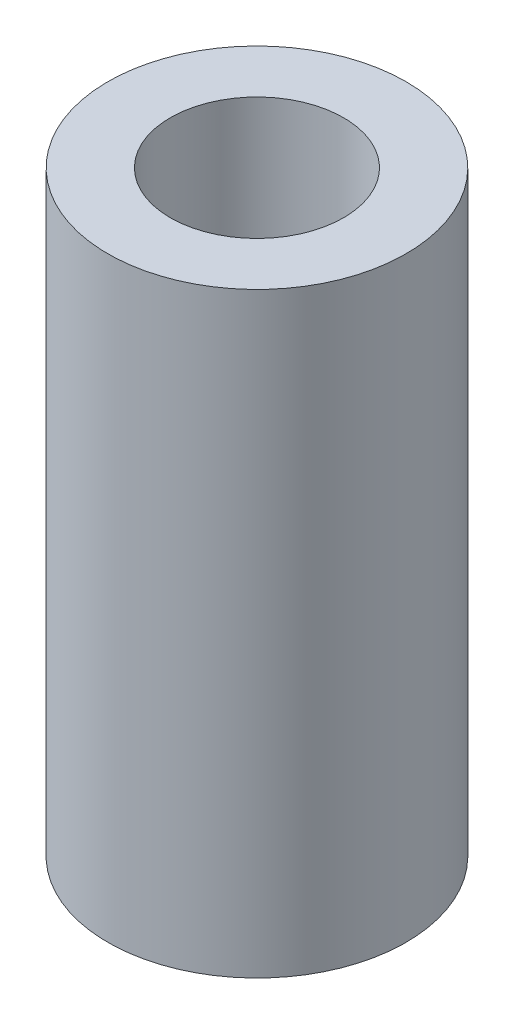
ISO-10303-21;
HEADER;
FILE_DESCRIPTION(('STEP AP214'),'2;1');
FILE_NAME('part.step','',(''),(''),'','','');
FILE_SCHEMA(('AUTOMOTIVE_DESIGN { 1 0 10303 214 1 1 1 1 }'));
ENDSEC;
DATA;
#1=APPLICATION_CONTEXT('core data for automotive mechanical design processes');
#2=APPLICATION_PROTOCOL_DEFINITION('international standard','automotive_design',2000,#1);
#3=PRODUCT_CONTEXT('',#1,'mechanical');
#4=PRODUCT('Part','Part','',(#3));
#5=PRODUCT_RELATED_PRODUCT_CATEGORY('part','',(#4));
#6=PRODUCT_DEFINITION_FORMATION('','',#4);
#7=PRODUCT_DEFINITION_CONTEXT('part definition',#1,'design');
#8=PRODUCT_DEFINITION('design','',#6,#7);
#9=PRODUCT_DEFINITION_SHAPE('','',#8);
#10=(LENGTH_UNIT() NAMED_UNIT(*) SI_UNIT(.MILLI.,.METRE.));
#11=(NAMED_UNIT(*) PLANE_ANGLE_UNIT() SI_UNIT($,.RADIAN.));
#12=(NAMED_UNIT(*) SI_UNIT($,.STERADIAN.) SOLID_ANGLE_UNIT());
#13=UNCERTAINTY_MEASURE_WITH_UNIT(LENGTH_MEASURE(1.E-05),#10,'distance_accuracy_value','');
#14=(GEOMETRIC_REPRESENTATION_CONTEXT(3) GLOBAL_UNCERTAINTY_ASSIGNED_CONTEXT((#13)) GLOBAL_UNIT_ASSIGNED_CONTEXT((#10,
#11,#12)) REPRESENTATION_CONTEXT('',''));
#15=CARTESIAN_POINT('',(0.,0.,0.));
#16=DIRECTION('',(0.,0.,1.));
#17=DIRECTION('',(1.,0.,0.));
#18=AXIS2_PLACEMENT_3D('',#15,#16,#17);
#19=CARTESIAN_POINT('',(-37.5034767926314,19.05,-4.70822868825244));
#20=DIRECTION('',(0.,-1.,0.));
#21=DIRECTION('',(0.,0.,-1.));
#22=AXIS2_PLACEMENT_3D('',#19,#20,#21);
#23=CYLINDRICAL_SURFACE('',#22,4.7625);
#24=CARTESIAN_POINT('',(-37.5034767926314,19.05,-4.70822868825244));
#25=DIRECTION('',(0.,1.,0.));
#26=DIRECTION('',(0.,0.,1.));
#27=AXIS2_PLACEMENT_3D('',#24,#25,#26);
#28=CIRCLE('',#27,4.7625);
#29=CARTESIAN_POINT('',(-37.5034767926314,19.05,-9.47072868825245));
#30=VERTEX_POINT('',#29);
#31=EDGE_CURVE('E10',#30,#30,#28,.T.);
#32=CARTESIAN_POINT('',(-37.5034767926314,0.,-4.70822868825244));
#33=DIRECTION('',(0.,1.,0.));
#34=DIRECTION('',(0.,0.,1.));
#35=AXIS2_PLACEMENT_3D('',#32,#33,#34);
#36=CIRCLE('',#35,4.7625);
#37=CARTESIAN_POINT('',(-37.5034767926314,0.,-9.47072868825245));
#38=VERTEX_POINT('',#37);
#39=EDGE_CURVE('E36',#38,#38,#36,.T.);
#40=CARTESIAN_POINT('',(-37.5034767926314,19.05,-9.47072868825245));
#41=CARTESIAN_POINT('',(-37.5034767926314,18.8515625,-9.47072868825245));
#42=CARTESIAN_POINT('',(-37.5034767926314,18.653125,-9.47072868825245));
#43=CARTESIAN_POINT('',(-37.5034767926314,18.25625,-9.47072868825245));
#44=CARTESIAN_POINT('',(-37.5034767926314,18.0578125,-9.47072868825245));
#45=CARTESIAN_POINT('',(-37.5034767926314,17.6609375,-9.47072868825245));
#46=CARTESIAN_POINT('',(-37.5034767926314,17.4625,-9.47072868825245));
#47=CARTESIAN_POINT('',(-37.5034767926314,17.065625,-9.47072868825245));
#48=CARTESIAN_POINT('',(-37.5034767926314,16.8671875,-9.47072868825245));
#49=CARTESIAN_POINT('',(-37.5034767926314,16.4703125,-9.47072868825245));
#50=CARTESIAN_POINT('',(-37.5034767926314,16.271875,-9.47072868825245));
#51=CARTESIAN_POINT('',(-37.5034767926314,15.875,-9.47072868825245));
#52=CARTESIAN_POINT('',(-37.5034767926314,15.6765625,-9.47072868825245));
#53=CARTESIAN_POINT('',(-37.5034767926314,15.2796875,-9.47072868825245));
#54=CARTESIAN_POINT('',(-37.5034767926314,15.08125,-9.47072868825245));
#55=CARTESIAN_POINT('',(-37.5034767926314,14.684375,-9.47072868825245));
#56=CARTESIAN_POINT('',(-37.5034767926314,14.4859375,-9.47072868825245));
#57=CARTESIAN_POINT('',(-37.5034767926314,14.0890625,-9.47072868825245));
#58=CARTESIAN_POINT('',(-37.5034767926314,13.890625,-9.47072868825245));
#59=CARTESIAN_POINT('',(-37.5034767926314,13.49375,-9.47072868825245));
#60=CARTESIAN_POINT('',(-37.5034767926314,13.2953125,-9.47072868825245));
#61=CARTESIAN_POINT('',(-37.5034767926314,12.8984375,-9.47072868825245));
#62=CARTESIAN_POINT('',(-37.5034767926314,12.7,-9.47072868825245));
#63=CARTESIAN_POINT('',(-37.5034767926314,12.303125,-9.47072868825245));
#64=CARTESIAN_POINT('',(-37.5034767926314,12.1046875,-9.47072868825245));
#65=CARTESIAN_POINT('',(-37.5034767926314,11.7078125,-9.47072868825245));
#66=CARTESIAN_POINT('',(-37.5034767926314,11.509375,-9.47072868825245));
#67=CARTESIAN_POINT('',(-37.5034767926314,11.1125,-9.47072868825245));
#68=CARTESIAN_POINT('',(-37.5034767926314,10.9140625,-9.47072868825245));
#69=CARTESIAN_POINT('',(-37.5034767926314,10.5171875,-9.47072868825245));
#70=CARTESIAN_POINT('',(-37.5034767926314,10.31875,-9.47072868825245));
#71=CARTESIAN_POINT('',(-37.5034767926314,9.921875,-9.47072868825245));
#72=CARTESIAN_POINT('',(-37.5034767926314,9.7234375,-9.47072868825245));
#73=CARTESIAN_POINT('',(-37.5034767926314,9.3265625,-9.47072868825245));
#74=CARTESIAN_POINT('',(-37.5034767926314,9.128125,-9.47072868825245));
#75=CARTESIAN_POINT('',(-37.5034767926314,8.73125,-9.47072868825245));
#76=CARTESIAN_POINT('',(-37.5034767926314,8.5328125,-9.47072868825245));
#77=CARTESIAN_POINT('',(-37.5034767926314,8.1359375,-9.47072868825245));
#78=CARTESIAN_POINT('',(-37.5034767926314,7.9375,-9.47072868825245));
#79=CARTESIAN_POINT('',(-37.5034767926314,7.540625,-9.47072868825245));
#80=CARTESIAN_POINT('',(-37.5034767926314,7.3421875,-9.47072868825245));
#81=CARTESIAN_POINT('',(-37.5034767926314,6.9453125,-9.47072868825245));
#82=CARTESIAN_POINT('',(-37.5034767926314,6.746875,-9.47072868825245));
#83=CARTESIAN_POINT('',(-37.5034767926314,6.35,-9.47072868825245));
#84=CARTESIAN_POINT('',(-37.5034767926314,6.1515625,-9.47072868825245));
#85=CARTESIAN_POINT('',(-37.5034767926314,5.7546875,-9.47072868825245));
#86=CARTESIAN_POINT('',(-37.5034767926314,5.55625,-9.47072868825245));
#87=CARTESIAN_POINT('',(-37.5034767926314,5.159375,-9.47072868825245));
#88=CARTESIAN_POINT('',(-37.5034767926314,4.9609375,-9.47072868825245));
#89=CARTESIAN_POINT('',(-37.5034767926314,4.5640625,-9.47072868825245));
#90=CARTESIAN_POINT('',(-37.5034767926314,4.365625,-9.47072868825245));
#91=CARTESIAN_POINT('',(-37.5034767926314,3.96875,-9.47072868825245));
#92=CARTESIAN_POINT('',(-37.5034767926314,3.7703125,-9.47072868825245));
#93=CARTESIAN_POINT('',(-37.5034767926314,3.3734375,-9.47072868825245));
#94=CARTESIAN_POINT('',(-37.5034767926314,3.175,-9.47072868825245));
#95=CARTESIAN_POINT('',(-37.5034767926314,2.778125,-9.47072868825245));
#96=CARTESIAN_POINT('',(-37.5034767926314,2.5796875,-9.47072868825245));
#97=CARTESIAN_POINT('',(-37.5034767926314,2.1828125,-9.47072868825245));
#98=CARTESIAN_POINT('',(-37.5034767926314,1.984375,-9.47072868825245));
#99=CARTESIAN_POINT('',(-37.5034767926314,1.5875,-9.47072868825245));
#100=CARTESIAN_POINT('',(-37.5034767926314,1.3890625,-9.47072868825245));
#101=CARTESIAN_POINT('',(-37.5034767926314,0.992187500000001,-9.47072868825245));
#102=CARTESIAN_POINT('',(-37.5034767926314,0.793750000000001,-9.47072868825245));
#103=CARTESIAN_POINT('',(-37.5034767926314,0.396875,-9.47072868825245));
#104=CARTESIAN_POINT('',(-37.5034767926314,0.1984375,-9.47072868825245));
#105=CARTESIAN_POINT('',(-37.5034767926314,0.,-9.47072868825245));
#106=B_SPLINE_CURVE_WITH_KNOTS('',3,(#40,#41,#42,#43,#44,#45,#46,#47,#48,#49,#50,#51,#52,#53,
#54,#55,#56,#57,#58,#59,#60,#61,#62,#63,#64,#65,#66,#67,#68,#69,#70,#71,#72,#73,#74,#75,#76,#77,
#78,#79,#80,#81,#82,#83,#84,#85,#86,#87,#88,#89,#90,#91,#92,#93,#94,#95,#96,#97,#98,#99,#100,
#101,#102,#103,#104,#105),.UNSPECIFIED.,.F.,.F.,(4,2,2,2,2,2,2,2,2,2,2,2,2,2,2,2,2,2,2,2,2,2,2,
2,2,2,2,2,2,2,2,2,4),(0.,0.5953125,1.190625,1.7859375,2.38125,2.9765625,3.571875,4.1671875,
4.7625,5.3578125,5.953125,6.5484375,7.14375,7.7390625,8.334375,8.9296875,9.525,10.1203125,
10.715625,11.3109375,11.90625,12.5015625,13.096875,13.6921875,14.2875,14.8828125,15.478125,
16.0734375,16.66875,17.2640625,17.859375,18.4546875,19.05),.UNSPECIFIED.);
#107=EDGE_CURVE('BSEAM33',#30,#38,#106,.T.);
#108=ORIENTED_EDGE('',*,*,#31,.F.);
#109=ORIENTED_EDGE('',*,*,#39,.T.);
#110=ORIENTED_EDGE('',*,*,#107,.T.);
#111=ORIENTED_EDGE('',*,*,#107,.F.);
#112=EDGE_LOOP('',(#108,#110,#109,#111));
#113=FACE_BOUND('',#112,.T.);
#114=ADVANCED_FACE('F33',(#113),#23,.T.);
#115=CARTESIAN_POINT('',(-37.5034767926314,19.05,-4.70822868825244));
#116=DIRECTION('',(0.,1.,0.));
#117=DIRECTION('',(0.,0.,1.));
#118=AXIS2_PLACEMENT_3D('',#115,#116,#117);
#119=PLANE('',#118);
#120=CARTESIAN_POINT('',(-37.5034767926314,19.05,-4.70822868825244));
#121=DIRECTION('',(0.,1.,0.));
#122=DIRECTION('',(0.,0.,1.));
#123=AXIS2_PLACEMENT_3D('',#120,#121,#122);
#124=CIRCLE('',#123,2.7686);
#125=CARTESIAN_POINT('',(-37.5034767926314,19.05,-1.93962868825244));
#126=VERTEX_POINT('',#125);
#127=EDGE_CURVE('E45',#126,#126,#124,.T.);
#128=ORIENTED_EDGE('',*,*,#127,.F.);
#129=EDGE_LOOP('',(#128));
#130=FACE_BOUND('',#129,.T.);
#131=ORIENTED_EDGE('',*,*,#31,.T.);
#132=EDGE_LOOP('',(#131));
#133=FACE_BOUND('',#132,.T.);
#134=ADVANCED_FACE('F60',(#130,#133),#119,.T.);
#135=CARTESIAN_POINT('',(-37.5034767926314,0.,-4.70822868825244));
#136=DIRECTION('',(0.,1.,0.));
#137=DIRECTION('',(0.,0.,1.));
#138=AXIS2_PLACEMENT_3D('',#135,#136,#137);
#139=PLANE('',#138);
#140=CARTESIAN_POINT('',(-37.5034767926314,0.,-4.70822868825244));
#141=DIRECTION('',(0.,1.,0.));
#142=DIRECTION('',(0.,0.,1.));
#143=AXIS2_PLACEMENT_3D('',#140,#141,#142);
#144=CIRCLE('',#143,2.7686);
#145=CARTESIAN_POINT('',(-37.5034767926314,0.,-1.93962868825244));
#146=VERTEX_POINT('',#145);
#147=EDGE_CURVE('E43',#146,#146,#144,.T.);
#148=ORIENTED_EDGE('',*,*,#147,.T.);
#149=EDGE_LOOP('',(#148));
#150=FACE_BOUND('',#149,.T.);
#151=ORIENTED_EDGE('',*,*,#39,.F.);
#152=EDGE_LOOP('',(#151));
#153=FACE_BOUND('',#152,.T.);
#154=ADVANCED_FACE('F51',(#150,#153),#139,.F.);
#155=CARTESIAN_POINT('',(-37.5034767926314,0.,-4.70822868825244));
#156=DIRECTION('',(0.,1.,0.));
#157=DIRECTION('',(0.,0.,1.));
#158=AXIS2_PLACEMENT_3D('',#155,#156,#157);
#159=CYLINDRICAL_SURFACE('',#158,2.7686);
#160=CARTESIAN_POINT('',(-37.5034767926314,0.,-1.93962868825244));
#161=CARTESIAN_POINT('',(-37.5034767926314,0.1984375,-1.93962868825244));
#162=CARTESIAN_POINT('',(-37.5034767926314,0.396875,-1.93962868825244));
#163=CARTESIAN_POINT('',(-37.5034767926314,0.79375,-1.93962868825244));
#164=CARTESIAN_POINT('',(-37.5034767926314,0.9921875,-1.93962868825244));
#165=CARTESIAN_POINT('',(-37.5034767926314,1.3890625,-1.93962868825244));
#166=CARTESIAN_POINT('',(-37.5034767926314,1.5875,-1.93962868825244));
#167=CARTESIAN_POINT('',(-37.5034767926314,1.984375,-1.93962868825244));
#168=CARTESIAN_POINT('',(-37.5034767926314,2.1828125,-1.93962868825244));
#169=CARTESIAN_POINT('',(-37.5034767926314,2.5796875,-1.93962868825244));
#170=CARTESIAN_POINT('',(-37.5034767926314,2.778125,-1.93962868825244));
#171=CARTESIAN_POINT('',(-37.5034767926314,3.175,-1.93962868825244));
#172=CARTESIAN_POINT('',(-37.5034767926314,3.3734375,-1.93962868825244));
#173=CARTESIAN_POINT('',(-37.5034767926314,3.7703125,-1.93962868825244));
#174=CARTESIAN_POINT('',(-37.5034767926314,3.96875,-1.93962868825244));
#175=CARTESIAN_POINT('',(-37.5034767926314,4.365625,-1.93962868825244));
#176=CARTESIAN_POINT('',(-37.5034767926314,4.5640625,-1.93962868825244));
#177=CARTESIAN_POINT('',(-37.5034767926314,4.9609375,-1.93962868825244));
#178=CARTESIAN_POINT('',(-37.5034767926314,5.159375,-1.93962868825244));
#179=CARTESIAN_POINT('',(-37.5034767926314,5.55625,-1.93962868825244));
#180=CARTESIAN_POINT('',(-37.5034767926314,5.7546875,-1.93962868825244));
#181=CARTESIAN_POINT('',(-37.5034767926314,6.1515625,-1.93962868825244));
#182=CARTESIAN_POINT('',(-37.5034767926314,6.35,-1.93962868825244));
#183=CARTESIAN_POINT('',(-37.5034767926314,6.746875,-1.93962868825244));
#184=CARTESIAN_POINT('',(-37.5034767926314,6.9453125,-1.93962868825244));
#185=CARTESIAN_POINT('',(-37.5034767926314,7.3421875,-1.93962868825244));
#186=CARTESIAN_POINT('',(-37.5034767926314,7.540625,-1.93962868825244));
#187=CARTESIAN_POINT('',(-37.5034767926314,7.9375,-1.93962868825244));
#188=CARTESIAN_POINT('',(-37.5034767926314,8.1359375,-1.93962868825244));
#189=CARTESIAN_POINT('',(-37.5034767926314,8.5328125,-1.93962868825244));
#190=CARTESIAN_POINT('',(-37.5034767926314,8.73125,-1.93962868825244));
#191=CARTESIAN_POINT('',(-37.5034767926314,9.128125,-1.93962868825244));
#192=CARTESIAN_POINT('',(-37.5034767926314,9.3265625,-1.93962868825244));
#193=CARTESIAN_POINT('',(-37.5034767926314,9.7234375,-1.93962868825244));
#194=CARTESIAN_POINT('',(-37.5034767926314,9.921875,-1.93962868825244));
#195=CARTESIAN_POINT('',(-37.5034767926314,10.31875,-1.93962868825244));
#196=CARTESIAN_POINT('',(-37.5034767926314,10.5171875,-1.93962868825244));
#197=CARTESIAN_POINT('',(-37.5034767926314,10.9140625,-1.93962868825244));
#198=CARTESIAN_POINT('',(-37.5034767926314,11.1125,-1.93962868825244));
#199=CARTESIAN_POINT('',(-37.5034767926314,11.509375,-1.93962868825244));
#200=CARTESIAN_POINT('',(-37.5034767926314,11.7078125,-1.93962868825244));
#201=CARTESIAN_POINT('',(-37.5034767926314,12.1046875,-1.93962868825244));
#202=CARTESIAN_POINT('',(-37.5034767926314,12.303125,-1.93962868825244));
#203=CARTESIAN_POINT('',(-37.5034767926314,12.7,-1.93962868825244));
#204=CARTESIAN_POINT('',(-37.5034767926314,12.8984375,-1.93962868825244));
#205=CARTESIAN_POINT('',(-37.5034767926314,13.2953125,-1.93962868825244));
#206=CARTESIAN_POINT('',(-37.5034767926314,13.49375,-1.93962868825244));
#207=CARTESIAN_POINT('',(-37.5034767926314,13.890625,-1.93962868825244));
#208=CARTESIAN_POINT('',(-37.5034767926314,14.0890625,-1.93962868825244));
#209=CARTESIAN_POINT('',(-37.5034767926314,14.4859375,-1.93962868825244));
#210=CARTESIAN_POINT('',(-37.5034767926314,14.684375,-1.93962868825244));
#211=CARTESIAN_POINT('',(-37.5034767926314,15.08125,-1.93962868825244));
#212=CARTESIAN_POINT('',(-37.5034767926314,15.2796875,-1.93962868825244));
#213=CARTESIAN_POINT('',(-37.5034767926314,15.6765625,-1.93962868825244));
#214=CARTESIAN_POINT('',(-37.5034767926314,15.875,-1.93962868825244));
#215=CARTESIAN_POINT('',(-37.5034767926314,16.271875,-1.93962868825244));
#216=CARTESIAN_POINT('',(-37.5034767926314,16.4703125,-1.93962868825244));
#217=CARTESIAN_POINT('',(-37.5034767926314,16.8671875,-1.93962868825244));
#218=CARTESIAN_POINT('',(-37.5034767926314,17.065625,-1.93962868825244));
#219=CARTESIAN_POINT('',(-37.5034767926314,17.4625,-1.93962868825244));
#220=CARTESIAN_POINT('',(-37.5034767926314,17.6609375,-1.93962868825244));
#221=CARTESIAN_POINT('',(-37.5034767926314,18.0578125,-1.93962868825244));
#222=CARTESIAN_POINT('',(-37.5034767926314,18.25625,-1.93962868825244));
#223=CARTESIAN_POINT('',(-37.5034767926314,18.653125,-1.93962868825244));
#224=CARTESIAN_POINT('',(-37.5034767926314,18.8515625,-1.93962868825244));
#225=CARTESIAN_POINT('',(-37.5034767926314,19.05,-1.93962868825244));
#226=B_SPLINE_CURVE_WITH_KNOTS('',3,(#160,#161,#162,#163,#164,#165,#166,#167,#168,#169,#170,
#171,#172,#173,#174,#175,#176,#177,#178,#179,#180,#181,#182,#183,#184,#185,#186,#187,#188,#189,
#190,#191,#192,#193,#194,#195,#196,#197,#198,#199,#200,#201,#202,#203,#204,#205,#206,#207,#208,
#209,#210,#211,#212,#213,#214,#215,#216,#217,#218,#219,#220,#221,#222,#223,#224,#225),
.UNSPECIFIED.,.F.,.F.,(4,2,2,2,2,2,2,2,2,2,2,2,2,2,2,2,2,2,2,2,2,2,2,2,2,2,2,2,2,2,2,2,4),(0.,
0.5953125,1.190625,1.7859375,2.38125,2.9765625,3.571875,4.1671875,4.7625,5.3578125,5.953125,
6.5484375,7.14375,7.7390625,8.334375,8.9296875,9.525,10.1203125,10.715625,11.3109375,11.90625,
12.5015625,13.096875,13.6921875,14.2875,14.8828125,15.478125,16.0734375,16.66875,17.2640625,
17.859375,18.4546875,19.05),.UNSPECIFIED.);
#227=EDGE_CURVE('BSEAM54',#146,#126,#226,.T.);
#228=ORIENTED_EDGE('',*,*,#147,.F.);
#229=ORIENTED_EDGE('',*,*,#127,.T.);
#230=ORIENTED_EDGE('',*,*,#227,.T.);
#231=ORIENTED_EDGE('',*,*,#227,.F.);
#232=EDGE_LOOP('',(#228,#230,#229,#231));
#233=FACE_BOUND('',#232,.T.);
#234=ADVANCED_FACE('F54',(#233),#159,.F.);
#235=CLOSED_SHELL('',(#114,#134,#154,#234));
#236=MANIFOLD_SOLID_BREP('B2',#235);
#237=ADVANCED_BREP_SHAPE_REPRESENTATION('',(#18,#236),#14);
#238=SHAPE_DEFINITION_REPRESENTATION(#9,#237);
ENDSEC;
END-ISO-10303-21;
